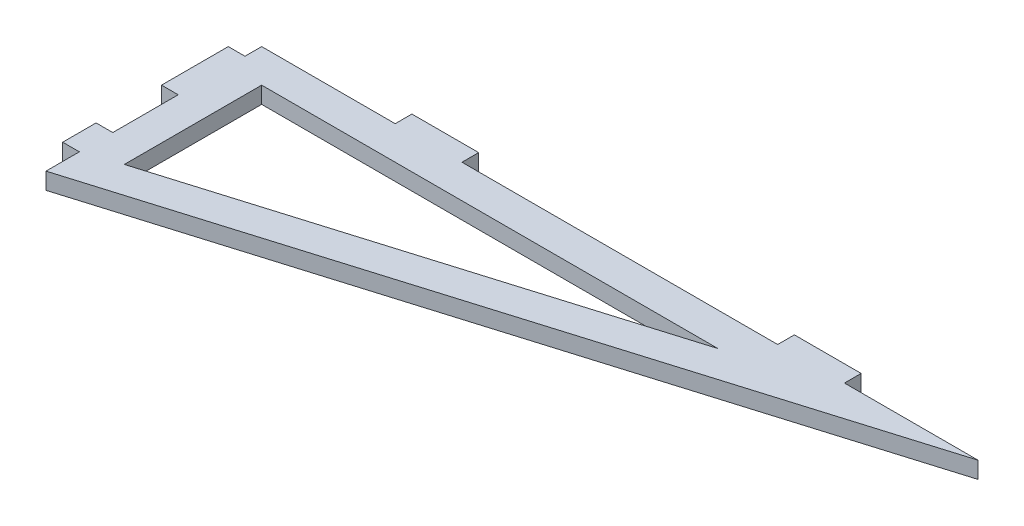
ISO-10303-21;
HEADER;
FILE_DESCRIPTION(('STEP AP214'),'2;1');
FILE_NAME('part.step','',(''),(''),'','','');
FILE_SCHEMA(('AUTOMOTIVE_DESIGN { 1 0 10303 214 1 1 1 1 }'));
ENDSEC;
DATA;
#1=APPLICATION_CONTEXT('core data for automotive mechanical design processes');
#2=APPLICATION_PROTOCOL_DEFINITION('international standard','automotive_design',2000,#1);
#3=PRODUCT_CONTEXT('',#1,'mechanical');
#4=PRODUCT('Part','Part','',(#3));
#5=PRODUCT_RELATED_PRODUCT_CATEGORY('part','',(#4));
#6=PRODUCT_DEFINITION_FORMATION('','',#4);
#7=PRODUCT_DEFINITION_CONTEXT('part definition',#1,'design');
#8=PRODUCT_DEFINITION('design','',#6,#7);
#9=PRODUCT_DEFINITION_SHAPE('','',#8);
#10=(LENGTH_UNIT() NAMED_UNIT(*) SI_UNIT(.MILLI.,.METRE.));
#11=(NAMED_UNIT(*) PLANE_ANGLE_UNIT() SI_UNIT($,.RADIAN.));
#12=(NAMED_UNIT(*) SI_UNIT($,.STERADIAN.) SOLID_ANGLE_UNIT());
#13=UNCERTAINTY_MEASURE_WITH_UNIT(LENGTH_MEASURE(1.E-05),#10,'distance_accuracy_value','');
#14=(GEOMETRIC_REPRESENTATION_CONTEXT(3) GLOBAL_UNCERTAINTY_ASSIGNED_CONTEXT((#13)) GLOBAL_UNIT_ASSIGNED_CONTEXT((#10,
#11,#12)) REPRESENTATION_CONTEXT('',''));
#15=CARTESIAN_POINT('',(0.,0.,0.));
#16=DIRECTION('',(0.,0.,1.));
#17=DIRECTION('',(1.,0.,0.));
#18=AXIS2_PLACEMENT_3D('',#15,#16,#17);
#19=CARTESIAN_POINT('',(0.,3.175,0.));
#20=DIRECTION('',(0.,-1.,0.));
#21=DIRECTION('',(0.,0.,-1.));
#22=AXIS2_PLACEMENT_3D('',#19,#20,#21);
#23=PLANE('',#22);
#24=DIRECTION('',(0.957542789492705,0.,-0.288291183164746));
#25=VECTOR('',#24,1.);
#26=CARTESIAN_POINT('',(-68.1228,3.175,20.51));
#27=LINE('',#26,#25);
#28=CARTESIAN_POINT('',(-68.1228,3.175,20.51));
#29=VERTEX_POINT('',#28);
#30=CARTESIAN_POINT('',(68.1228,3.175,-20.51));
#31=VERTEX_POINT('',#30);
#32=EDGE_CURVE('E209',#29,#31,#27,.T.);
#33=ORIENTED_EDGE('',*,*,#32,.T.);
#34=DIRECTION('',(-1.,0.,0.));
#35=VECTOR('',#34,1.);
#36=CARTESIAN_POINT('',(68.1228,3.175,-20.51));
#37=LINE('',#36,#35);
#38=CARTESIAN_POINT('',(42.7228,3.175,-20.51));
#39=VERTEX_POINT('',#38);
#40=EDGE_CURVE('E212',#31,#39,#37,.T.);
#41=ORIENTED_EDGE('',*,*,#40,.T.);
#42=DIRECTION('',(0.,0.,-1.));
#43=VECTOR('',#42,1.);
#44=CARTESIAN_POINT('',(42.7228,3.175,-23.685));
#45=LINE('',#44,#43);
#46=CARTESIAN_POINT('',(42.7228,3.175,-23.685));
#47=VERTEX_POINT('',#46);
#48=EDGE_CURVE('E215',#39,#47,#45,.T.);
#49=ORIENTED_EDGE('',*,*,#48,.T.);
#50=DIRECTION('',(-1.,0.,0.));
#51=VECTOR('',#50,1.);
#52=CARTESIAN_POINT('',(30.0228,3.175,-23.685));
#53=LINE('',#52,#51);
#54=CARTESIAN_POINT('',(30.0228,3.175,-23.685));
#55=VERTEX_POINT('',#54);
#56=EDGE_CURVE('E217',#47,#55,#53,.T.);
#57=ORIENTED_EDGE('',*,*,#56,.T.);
#58=DIRECTION('',(0.,0.,1.));
#59=VECTOR('',#58,1.);
#60=CARTESIAN_POINT('',(30.0228,3.175,-20.51));
#61=LINE('',#60,#59);
#62=CARTESIAN_POINT('',(30.0228,3.175,-20.51));
#63=VERTEX_POINT('',#62);
#64=EDGE_CURVE('E219',#55,#63,#61,.T.);
#65=ORIENTED_EDGE('',*,*,#64,.T.);
#66=DIRECTION('',(-1.,0.,0.));
#67=VECTOR('',#66,1.);
#68=CARTESIAN_POINT('',(30.0228,3.175,-20.51));
#69=LINE('',#68,#67);
#70=CARTESIAN_POINT('',(-30.0228,3.175,-20.51));
#71=VERTEX_POINT('',#70);
#72=EDGE_CURVE('E221',#63,#71,#69,.T.);
#73=ORIENTED_EDGE('',*,*,#72,.T.);
#74=DIRECTION('',(0.,0.,-1.));
#75=VECTOR('',#74,1.);
#76=CARTESIAN_POINT('',(-30.0228,3.175,-23.685));
#77=LINE('',#76,#75);
#78=CARTESIAN_POINT('',(-30.0228,3.175,-23.685));
#79=VERTEX_POINT('',#78);
#80=EDGE_CURVE('E223',#71,#79,#77,.T.);
#81=ORIENTED_EDGE('',*,*,#80,.T.);
#82=DIRECTION('',(-1.,0.,0.));
#83=VECTOR('',#82,1.);
#84=CARTESIAN_POINT('',(-42.7228,3.175,-23.685));
#85=LINE('',#84,#83);
#86=CARTESIAN_POINT('',(-42.7228,3.175,-23.685));
#87=VERTEX_POINT('',#86);
#88=EDGE_CURVE('E225',#79,#87,#85,.T.);
#89=ORIENTED_EDGE('',*,*,#88,.T.);
#90=DIRECTION('',(0.,0.,1.));
#91=VECTOR('',#90,1.);
#92=CARTESIAN_POINT('',(-42.7228,3.175,-20.51));
#93=LINE('',#92,#91);
#94=CARTESIAN_POINT('',(-42.7228,3.175,-20.51));
#95=VERTEX_POINT('',#94);
#96=EDGE_CURVE('E227',#87,#95,#93,.T.);
#97=ORIENTED_EDGE('',*,*,#96,.T.);
#98=DIRECTION('',(-1.,0.,0.));
#99=VECTOR('',#98,1.);
#100=CARTESIAN_POINT('',(-42.7228,3.175,-20.51));
#101=LINE('',#100,#99);
#102=CARTESIAN_POINT('',(-68.1228,3.175,-20.51));
#103=VERTEX_POINT('',#102);
#104=EDGE_CURVE('E229',#95,#103,#101,.T.);
#105=ORIENTED_EDGE('',*,*,#104,.T.);
#106=DIRECTION('',(0.,0.,1.));
#107=VECTOR('',#106,1.);
#108=CARTESIAN_POINT('',(-68.1228,3.175,-20.51));
#109=LINE('',#108,#107);
#110=CARTESIAN_POINT('',(-68.1228,3.175,-17.335));
#111=VERTEX_POINT('',#110);
#112=EDGE_CURVE('E231',#103,#111,#109,.T.);
#113=ORIENTED_EDGE('',*,*,#112,.T.);
#114=DIRECTION('',(-1.,0.,0.));
#115=VECTOR('',#114,1.);
#116=CARTESIAN_POINT('',(-71.2978,3.175,-17.335));
#117=LINE('',#116,#115);
#118=CARTESIAN_POINT('',(-71.2978,3.175,-17.335));
#119=VERTEX_POINT('',#118);
#120=EDGE_CURVE('E233',#111,#119,#117,.T.);
#121=ORIENTED_EDGE('',*,*,#120,.T.);
#122=DIRECTION('',(0.,0.,1.));
#123=VECTOR('',#122,1.);
#124=CARTESIAN_POINT('',(-71.2978,3.175,-4.63499999999999));
#125=LINE('',#124,#123);
#126=CARTESIAN_POINT('',(-71.2978,3.175,-4.63499999999999));
#127=VERTEX_POINT('',#126);
#128=EDGE_CURVE('E235',#119,#127,#125,.T.);
#129=ORIENTED_EDGE('',*,*,#128,.T.);
#130=DIRECTION('',(1.,0.,0.));
#131=VECTOR('',#130,1.);
#132=CARTESIAN_POINT('',(-71.2978,3.175,-4.63499999999999));
#133=LINE('',#132,#131);
#134=CARTESIAN_POINT('',(-68.1228,3.175,-4.63499999999999));
#135=VERTEX_POINT('',#134);
#136=EDGE_CURVE('E237',#127,#135,#133,.T.);
#137=ORIENTED_EDGE('',*,*,#136,.T.);
#138=DIRECTION('',(0.,0.,1.));
#139=VECTOR('',#138,1.);
#140=CARTESIAN_POINT('',(-68.1228,3.175,-4.63499999999999));
#141=LINE('',#140,#139);
#142=CARTESIAN_POINT('',(-68.1228,3.175,7.81));
#143=VERTEX_POINT('',#142);
#144=EDGE_CURVE('E239',#135,#143,#141,.T.);
#145=ORIENTED_EDGE('',*,*,#144,.T.);
#146=DIRECTION('',(-1.,0.,0.));
#147=VECTOR('',#146,1.);
#148=CARTESIAN_POINT('',(-68.1228,3.175,7.81));
#149=LINE('',#148,#147);
#150=CARTESIAN_POINT('',(-71.2978,3.175,7.81));
#151=VERTEX_POINT('',#150);
#152=EDGE_CURVE('E241',#143,#151,#149,.T.);
#153=ORIENTED_EDGE('',*,*,#152,.T.);
#154=DIRECTION('',(0.,0.,1.));
#155=VECTOR('',#154,1.);
#156=CARTESIAN_POINT('',(-71.2978,3.175,7.81));
#157=LINE('',#156,#155);
#158=CARTESIAN_POINT('',(-71.2978,3.175,14.16));
#159=VERTEX_POINT('',#158);
#160=EDGE_CURVE('E243',#151,#159,#157,.T.);
#161=ORIENTED_EDGE('',*,*,#160,.T.);
#162=DIRECTION('',(1.,0.,0.));
#163=VECTOR('',#162,1.);
#164=CARTESIAN_POINT('',(-71.2978,3.175,14.16));
#165=LINE('',#164,#163);
#166=CARTESIAN_POINT('',(-68.1228,3.175,14.16));
#167=VERTEX_POINT('',#166);
#168=EDGE_CURVE('E245',#159,#167,#165,.T.);
#169=ORIENTED_EDGE('',*,*,#168,.T.);
#170=DIRECTION('',(0.,0.,1.));
#171=VECTOR('',#170,1.);
#172=CARTESIAN_POINT('',(-68.1228,3.175,14.16));
#173=LINE('',#172,#171);
#174=EDGE_CURVE('E247',#167,#29,#173,.T.);
#175=ORIENTED_EDGE('',*,*,#174,.T.);
#176=EDGE_LOOP('',(#33,#41,#49,#57,#65,#73,#81,#89,#97,#105,#113,#121,#129,#137,#145,#153,#161,
#169,#175));
#177=FACE_BOUND('',#176,.T.);
#178=DIRECTION('',(-1.,0.,0.));
#179=VECTOR('',#178,1.);
#180=CARTESIAN_POINT('',(25.0052943696762,3.175,-14.16));
#181=LINE('',#180,#179);
#182=CARTESIAN_POINT('',(25.0052943696762,3.175,-14.16));
#183=VERTEX_POINT('',#182);
#184=CARTESIAN_POINT('',(-61.7728,3.175,-14.16));
#185=VERTEX_POINT('',#184);
#186=EDGE_CURVE('E182',#183,#185,#181,.T.);
#187=ORIENTED_EDGE('',*,*,#186,.F.);
#188=DIRECTION('',(0.957542789492705,0.,-0.288291183164746));
#189=VECTOR('',#188,1.);
#190=CARTESIAN_POINT('',(-61.7728,3.175,11.9666230325538));
#191=LINE('',#190,#189);
#192=CARTESIAN_POINT('',(-61.7728,3.175,11.9666230325538));
#193=VERTEX_POINT('',#192);
#194=EDGE_CURVE('E199',#193,#183,#191,.T.);
#195=ORIENTED_EDGE('',*,*,#194,.F.);
#196=DIRECTION('',(0.,0.,1.));
#197=VECTOR('',#196,1.);
#198=CARTESIAN_POINT('',(-61.7728,3.175,-14.16));
#199=LINE('',#198,#197);
#200=EDGE_CURVE('E190',#185,#193,#199,.T.);
#201=ORIENTED_EDGE('',*,*,#200,.F.);
#202=EDGE_LOOP('',(#187,#195,#201));
#203=FACE_BOUND('',#202,.T.);
#204=ADVANCED_FACE('F33',(#177,#203),#23,.F.);
#205=CARTESIAN_POINT('',(0.,0.,0.));
#206=DIRECTION('',(0.,-1.,0.));
#207=DIRECTION('',(0.,0.,-1.));
#208=AXIS2_PLACEMENT_3D('',#205,#206,#207);
#209=PLANE('',#208);
#210=DIRECTION('',(0.957542789492705,0.,-0.288291183164746));
#211=VECTOR('',#210,1.);
#212=CARTESIAN_POINT('',(-68.1228,0.,20.51));
#213=LINE('',#212,#211);
#214=CARTESIAN_POINT('',(-68.1228,0.,20.51));
#215=VERTEX_POINT('',#214);
#216=CARTESIAN_POINT('',(68.1228,0.,-20.51));
#217=VERTEX_POINT('',#216);
#218=EDGE_CURVE('E197',#215,#217,#213,.T.);
#219=ORIENTED_EDGE('',*,*,#218,.F.);
#220=DIRECTION('',(0.,0.,1.));
#221=VECTOR('',#220,1.);
#222=CARTESIAN_POINT('',(-68.1228,0.,14.16));
#223=LINE('',#222,#221);
#224=CARTESIAN_POINT('',(-68.1228,0.,14.16));
#225=VERTEX_POINT('',#224);
#226=EDGE_CURVE('E213',#225,#215,#223,.T.);
#227=ORIENTED_EDGE('',*,*,#226,.F.);
#228=DIRECTION('',(1.,0.,0.));
#229=VECTOR('',#228,1.);
#230=CARTESIAN_POINT('',(-71.2978,0.,14.16));
#231=LINE('',#230,#229);
#232=CARTESIAN_POINT('',(-71.2978,0.,14.16));
#233=VERTEX_POINT('',#232);
#234=EDGE_CURVE('E284',#233,#225,#231,.T.);
#235=ORIENTED_EDGE('',*,*,#234,.F.);
#236=DIRECTION('',(0.,0.,1.));
#237=VECTOR('',#236,1.);
#238=CARTESIAN_POINT('',(-71.2978,0.,7.81));
#239=LINE('',#238,#237);
#240=CARTESIAN_POINT('',(-71.2978,0.,7.81));
#241=VERTEX_POINT('',#240);
#242=EDGE_CURVE('E282',#241,#233,#239,.T.);
#243=ORIENTED_EDGE('',*,*,#242,.F.);
#244=DIRECTION('',(-1.,0.,0.));
#245=VECTOR('',#244,1.);
#246=CARTESIAN_POINT('',(-68.1228,0.,7.81));
#247=LINE('',#246,#245);
#248=CARTESIAN_POINT('',(-68.1228,0.,7.81));
#249=VERTEX_POINT('',#248);
#250=EDGE_CURVE('E280',#249,#241,#247,.T.);
#251=ORIENTED_EDGE('',*,*,#250,.F.);
#252=DIRECTION('',(0.,0.,1.));
#253=VECTOR('',#252,1.);
#254=CARTESIAN_POINT('',(-68.1228,0.,-4.63499999999999));
#255=LINE('',#254,#253);
#256=CARTESIAN_POINT('',(-68.1228,0.,-4.63499999999999));
#257=VERTEX_POINT('',#256);
#258=EDGE_CURVE('E278',#257,#249,#255,.T.);
#259=ORIENTED_EDGE('',*,*,#258,.F.);
#260=DIRECTION('',(1.,0.,0.));
#261=VECTOR('',#260,1.);
#262=CARTESIAN_POINT('',(-71.2978,0.,-4.63499999999999));
#263=LINE('',#262,#261);
#264=CARTESIAN_POINT('',(-71.2978,0.,-4.63499999999999));
#265=VERTEX_POINT('',#264);
#266=EDGE_CURVE('E276',#265,#257,#263,.T.);
#267=ORIENTED_EDGE('',*,*,#266,.F.);
#268=DIRECTION('',(0.,0.,1.));
#269=VECTOR('',#268,1.);
#270=CARTESIAN_POINT('',(-71.2978,0.,-4.63499999999999));
#271=LINE('',#270,#269);
#272=CARTESIAN_POINT('',(-71.2978,0.,-17.335));
#273=VERTEX_POINT('',#272);
#274=EDGE_CURVE('E274',#273,#265,#271,.T.);
#275=ORIENTED_EDGE('',*,*,#274,.F.);
#276=DIRECTION('',(-1.,0.,0.));
#277=VECTOR('',#276,1.);
#278=CARTESIAN_POINT('',(-71.2978,0.,-17.335));
#279=LINE('',#278,#277);
#280=CARTESIAN_POINT('',(-68.1228,0.,-17.335));
#281=VERTEX_POINT('',#280);
#282=EDGE_CURVE('E272',#281,#273,#279,.T.);
#283=ORIENTED_EDGE('',*,*,#282,.F.);
#284=DIRECTION('',(0.,0.,1.));
#285=VECTOR('',#284,1.);
#286=CARTESIAN_POINT('',(-68.1228,0.,-20.51));
#287=LINE('',#286,#285);
#288=CARTESIAN_POINT('',(-68.1228,0.,-20.51));
#289=VERTEX_POINT('',#288);
#290=EDGE_CURVE('E270',#289,#281,#287,.T.);
#291=ORIENTED_EDGE('',*,*,#290,.F.);
#292=DIRECTION('',(-1.,0.,0.));
#293=VECTOR('',#292,1.);
#294=CARTESIAN_POINT('',(-42.7228,0.,-20.51));
#295=LINE('',#294,#293);
#296=CARTESIAN_POINT('',(-42.7228,0.,-20.51));
#297=VERTEX_POINT('',#296);
#298=EDGE_CURVE('E268',#297,#289,#295,.T.);
#299=ORIENTED_EDGE('',*,*,#298,.F.);
#300=DIRECTION('',(0.,0.,1.));
#301=VECTOR('',#300,1.);
#302=CARTESIAN_POINT('',(-42.7228,0.,-20.51));
#303=LINE('',#302,#301);
#304=CARTESIAN_POINT('',(-42.7228,0.,-23.685));
#305=VERTEX_POINT('',#304);
#306=EDGE_CURVE('E266',#305,#297,#303,.T.);
#307=ORIENTED_EDGE('',*,*,#306,.F.);
#308=DIRECTION('',(-1.,0.,0.));
#309=VECTOR('',#308,1.);
#310=CARTESIAN_POINT('',(-42.7228,0.,-23.685));
#311=LINE('',#310,#309);
#312=CARTESIAN_POINT('',(-30.0228,0.,-23.685));
#313=VERTEX_POINT('',#312);
#314=EDGE_CURVE('E264',#313,#305,#311,.T.);
#315=ORIENTED_EDGE('',*,*,#314,.F.);
#316=DIRECTION('',(0.,0.,-1.));
#317=VECTOR('',#316,1.);
#318=CARTESIAN_POINT('',(-30.0228,0.,-23.685));
#319=LINE('',#318,#317);
#320=CARTESIAN_POINT('',(-30.0228,0.,-20.51));
#321=VERTEX_POINT('',#320);
#322=EDGE_CURVE('E262',#321,#313,#319,.T.);
#323=ORIENTED_EDGE('',*,*,#322,.F.);
#324=DIRECTION('',(-1.,0.,0.));
#325=VECTOR('',#324,1.);
#326=CARTESIAN_POINT('',(30.0228,0.,-20.51));
#327=LINE('',#326,#325);
#328=CARTESIAN_POINT('',(30.0228,0.,-20.51));
#329=VERTEX_POINT('',#328);
#330=EDGE_CURVE('E260',#329,#321,#327,.T.);
#331=ORIENTED_EDGE('',*,*,#330,.F.);
#332=DIRECTION('',(0.,0.,1.));
#333=VECTOR('',#332,1.);
#334=CARTESIAN_POINT('',(30.0228,0.,-20.51));
#335=LINE('',#334,#333);
#336=CARTESIAN_POINT('',(30.0228,0.,-23.685));
#337=VERTEX_POINT('',#336);
#338=EDGE_CURVE('E258',#337,#329,#335,.T.);
#339=ORIENTED_EDGE('',*,*,#338,.F.);
#340=DIRECTION('',(-1.,0.,0.));
#341=VECTOR('',#340,1.);
#342=CARTESIAN_POINT('',(30.0228,0.,-23.685));
#343=LINE('',#342,#341);
#344=CARTESIAN_POINT('',(42.7228,0.,-23.685));
#345=VERTEX_POINT('',#344);
#346=EDGE_CURVE('E256',#345,#337,#343,.T.);
#347=ORIENTED_EDGE('',*,*,#346,.F.);
#348=DIRECTION('',(0.,0.,-1.));
#349=VECTOR('',#348,1.);
#350=CARTESIAN_POINT('',(42.7228,0.,-23.685));
#351=LINE('',#350,#349);
#352=CARTESIAN_POINT('',(42.7228,0.,-20.51));
#353=VERTEX_POINT('',#352);
#354=EDGE_CURVE('E254',#353,#345,#351,.T.);
#355=ORIENTED_EDGE('',*,*,#354,.F.);
#356=DIRECTION('',(-1.,0.,0.));
#357=VECTOR('',#356,1.);
#358=CARTESIAN_POINT('',(68.1228,0.,-20.51));
#359=LINE('',#358,#357);
#360=EDGE_CURVE('E252',#217,#353,#359,.T.);
#361=ORIENTED_EDGE('',*,*,#360,.F.);
#362=EDGE_LOOP('',(#219,#227,#235,#243,#251,#259,#267,#275,#283,#291,#299,#307,#315,#323,#331,
#339,#347,#355,#361));
#363=FACE_BOUND('',#362,.T.);
#364=DIRECTION('',(0.957542789492705,0.,-0.288291183164746));
#365=VECTOR('',#364,1.);
#366=CARTESIAN_POINT('',(-61.7728,0.,11.9666230325538));
#367=LINE('',#366,#365);
#368=CARTESIAN_POINT('',(-61.7728,0.,11.9666230325538));
#369=VERTEX_POINT('',#368);
#370=CARTESIAN_POINT('',(25.0052943696762,0.,-14.16));
#371=VERTEX_POINT('',#370);
#372=EDGE_CURVE('E191',#369,#371,#367,.T.);
#373=ORIENTED_EDGE('',*,*,#372,.T.);
#374=DIRECTION('',(-1.,0.,0.));
#375=VECTOR('',#374,1.);
#376=CARTESIAN_POINT('',(25.0052943696762,0.,-14.16));
#377=LINE('',#376,#375);
#378=CARTESIAN_POINT('',(-61.7728,0.,-14.16));
#379=VERTEX_POINT('',#378);
#380=EDGE_CURVE('E56',#371,#379,#377,.T.);
#381=ORIENTED_EDGE('',*,*,#380,.T.);
#382=DIRECTION('',(0.,0.,1.));
#383=VECTOR('',#382,1.);
#384=CARTESIAN_POINT('',(-61.7728,0.,-14.16));
#385=LINE('',#384,#383);
#386=EDGE_CURVE('E196',#379,#369,#385,.T.);
#387=ORIENTED_EDGE('',*,*,#386,.T.);
#388=EDGE_LOOP('',(#373,#381,#387));
#389=FACE_BOUND('',#388,.T.);
#390=ADVANCED_FACE('F347',(#363,#389),#209,.T.);
#391=CARTESIAN_POINT('',(-68.1228,3.175,20.51));
#392=DIRECTION('',(-0.288291183164746,0.,-0.957542789492705));
#393=DIRECTION('',(-0.957542789492705,0.,0.288291183164746));
#394=AXIS2_PLACEMENT_3D('',#391,#392,#393);
#395=PLANE('',#394);
#396=ORIENTED_EDGE('',*,*,#218,.T.);
#397=DIRECTION('',(0.,-1.,0.));
#398=VECTOR('',#397,1.);
#399=CARTESIAN_POINT('',(68.1228,3.175,-20.51));
#400=LINE('',#399,#398);
#401=EDGE_CURVE('E11',#31,#217,#400,.T.);
#402=ORIENTED_EDGE('',*,*,#401,.F.);
#403=ORIENTED_EDGE('',*,*,#32,.F.);
#404=DIRECTION('',(0.,-1.,0.));
#405=VECTOR('',#404,1.);
#406=CARTESIAN_POINT('',(-68.1228,3.175,20.51));
#407=LINE('',#406,#405);
#408=EDGE_CURVE('E249',#29,#215,#407,.T.);
#409=ORIENTED_EDGE('',*,*,#408,.T.);
#410=EDGE_LOOP('',(#396,#402,#403,#409));
#411=FACE_BOUND('',#410,.T.);
#412=ADVANCED_FACE('F35',(#411),#395,.F.);
#413=CARTESIAN_POINT('',(68.1228,3.175,-20.51));
#414=DIRECTION('',(0.,0.,1.));
#415=DIRECTION('',(1.,0.,0.));
#416=AXIS2_PLACEMENT_3D('',#413,#414,#415);
#417=PLANE('',#416);
#418=ORIENTED_EDGE('',*,*,#360,.T.);
#419=DIRECTION('',(0.,-1.,0.));
#420=VECTOR('',#419,1.);
#421=CARTESIAN_POINT('',(42.7228,3.175,-20.51));
#422=LINE('',#421,#420);
#423=EDGE_CURVE('E41',#39,#353,#422,.T.);
#424=ORIENTED_EDGE('',*,*,#423,.F.);
#425=ORIENTED_EDGE('',*,*,#40,.F.);
#426=ORIENTED_EDGE('',*,*,#401,.T.);
#427=EDGE_LOOP('',(#418,#424,#425,#426));
#428=FACE_BOUND('',#427,.T.);
#429=ADVANCED_FACE('F364',(#428),#417,.F.);
#430=CARTESIAN_POINT('',(42.7228,3.175,-23.685));
#431=DIRECTION('',(-1.,0.,0.));
#432=DIRECTION('',(0.,0.,1.));
#433=AXIS2_PLACEMENT_3D('',#430,#431,#432);
#434=PLANE('',#433);
#435=ORIENTED_EDGE('',*,*,#354,.T.);
#436=DIRECTION('',(0.,-1.,0.));
#437=VECTOR('',#436,1.);
#438=CARTESIAN_POINT('',(42.7228,3.175,-23.685));
#439=LINE('',#438,#437);
#440=EDGE_CURVE('E334',#47,#345,#439,.T.);
#441=ORIENTED_EDGE('',*,*,#440,.F.);
#442=ORIENTED_EDGE('',*,*,#48,.F.);
#443=ORIENTED_EDGE('',*,*,#423,.T.);
#444=EDGE_LOOP('',(#435,#441,#442,#443));
#445=FACE_BOUND('',#444,.T.);
#446=ADVANCED_FACE('F341',(#445),#434,.F.);
#447=CARTESIAN_POINT('',(30.0228,3.175,-23.685));
#448=DIRECTION('',(0.,0.,1.));
#449=DIRECTION('',(1.,0.,0.));
#450=AXIS2_PLACEMENT_3D('',#447,#448,#449);
#451=PLANE('',#450);
#452=ORIENTED_EDGE('',*,*,#346,.T.);
#453=DIRECTION('',(0.,-1.,0.));
#454=VECTOR('',#453,1.);
#455=CARTESIAN_POINT('',(30.0228,3.175,-23.685));
#456=LINE('',#455,#454);
#457=EDGE_CURVE('E331',#55,#337,#456,.T.);
#458=ORIENTED_EDGE('',*,*,#457,.F.);
#459=ORIENTED_EDGE('',*,*,#56,.F.);
#460=ORIENTED_EDGE('',*,*,#440,.T.);
#461=EDGE_LOOP('',(#452,#458,#459,#460));
#462=FACE_BOUND('',#461,.T.);
#463=ADVANCED_FACE('F353',(#462),#451,.F.);
#464=CARTESIAN_POINT('',(30.0228,3.175,-20.51));
#465=DIRECTION('',(1.,0.,0.));
#466=DIRECTION('',(0.,0.,-1.));
#467=AXIS2_PLACEMENT_3D('',#464,#465,#466);
#468=PLANE('',#467);
#469=ORIENTED_EDGE('',*,*,#338,.T.);
#470=DIRECTION('',(0.,-1.,0.));
#471=VECTOR('',#470,1.);
#472=CARTESIAN_POINT('',(30.0228,3.175,-20.51));
#473=LINE('',#472,#471);
#474=EDGE_CURVE('E328',#63,#329,#473,.T.);
#475=ORIENTED_EDGE('',*,*,#474,.F.);
#476=ORIENTED_EDGE('',*,*,#64,.F.);
#477=ORIENTED_EDGE('',*,*,#457,.T.);
#478=EDGE_LOOP('',(#469,#475,#476,#477));
#479=FACE_BOUND('',#478,.T.);
#480=ADVANCED_FACE('F357',(#479),#468,.F.);
#481=CARTESIAN_POINT('',(30.0228,3.175,-20.51));
#482=DIRECTION('',(0.,0.,1.));
#483=DIRECTION('',(1.,0.,0.));
#484=AXIS2_PLACEMENT_3D('',#481,#482,#483);
#485=PLANE('',#484);
#486=ORIENTED_EDGE('',*,*,#330,.T.);
#487=DIRECTION('',(0.,-1.,0.));
#488=VECTOR('',#487,1.);
#489=CARTESIAN_POINT('',(-30.0228,3.175,-20.51));
#490=LINE('',#489,#488);
#491=EDGE_CURVE('E325',#71,#321,#490,.T.);
#492=ORIENTED_EDGE('',*,*,#491,.F.);
#493=ORIENTED_EDGE('',*,*,#72,.F.);
#494=ORIENTED_EDGE('',*,*,#474,.T.);
#495=EDGE_LOOP('',(#486,#492,#493,#494));
#496=FACE_BOUND('',#495,.T.);
#497=ADVANCED_FACE('F432',(#496),#485,.F.);
#498=CARTESIAN_POINT('',(-30.0228,3.175,-23.685));
#499=DIRECTION('',(-1.,0.,0.));
#500=DIRECTION('',(0.,0.,1.));
#501=AXIS2_PLACEMENT_3D('',#498,#499,#500);
#502=PLANE('',#501);
#503=ORIENTED_EDGE('',*,*,#322,.T.);
#504=DIRECTION('',(0.,-1.,0.));
#505=VECTOR('',#504,1.);
#506=CARTESIAN_POINT('',(-30.0228,3.175,-23.685));
#507=LINE('',#506,#505);
#508=EDGE_CURVE('E322',#79,#313,#507,.T.);
#509=ORIENTED_EDGE('',*,*,#508,.F.);
#510=ORIENTED_EDGE('',*,*,#80,.F.);
#511=ORIENTED_EDGE('',*,*,#491,.T.);
#512=EDGE_LOOP('',(#503,#509,#510,#511));
#513=FACE_BOUND('',#512,.T.);
#514=ADVANCED_FACE('F429',(#513),#502,.F.);
#515=CARTESIAN_POINT('',(-42.7228,3.175,-23.685));
#516=DIRECTION('',(0.,0.,1.));
#517=DIRECTION('',(1.,0.,0.));
#518=AXIS2_PLACEMENT_3D('',#515,#516,#517);
#519=PLANE('',#518);
#520=ORIENTED_EDGE('',*,*,#314,.T.);
#521=DIRECTION('',(0.,-1.,0.));
#522=VECTOR('',#521,1.);
#523=CARTESIAN_POINT('',(-42.7228,3.175,-23.685));
#524=LINE('',#523,#522);
#525=EDGE_CURVE('E319',#87,#305,#524,.T.);
#526=ORIENTED_EDGE('',*,*,#525,.F.);
#527=ORIENTED_EDGE('',*,*,#88,.F.);
#528=ORIENTED_EDGE('',*,*,#508,.T.);
#529=EDGE_LOOP('',(#520,#526,#527,#528));
#530=FACE_BOUND('',#529,.T.);
#531=ADVANCED_FACE('F425',(#530),#519,.F.);
#532=CARTESIAN_POINT('',(-42.7228,3.175,-20.51));
#533=DIRECTION('',(1.,0.,0.));
#534=DIRECTION('',(0.,0.,-1.));
#535=AXIS2_PLACEMENT_3D('',#532,#533,#534);
#536=PLANE('',#535);
#537=ORIENTED_EDGE('',*,*,#306,.T.);
#538=DIRECTION('',(0.,-1.,0.));
#539=VECTOR('',#538,1.);
#540=CARTESIAN_POINT('',(-42.7228,3.175,-20.51));
#541=LINE('',#540,#539);
#542=EDGE_CURVE('E316',#95,#297,#541,.T.);
#543=ORIENTED_EDGE('',*,*,#542,.F.);
#544=ORIENTED_EDGE('',*,*,#96,.F.);
#545=ORIENTED_EDGE('',*,*,#525,.T.);
#546=EDGE_LOOP('',(#537,#543,#544,#545));
#547=FACE_BOUND('',#546,.T.);
#548=ADVANCED_FACE('F421',(#547),#536,.F.);
#549=CARTESIAN_POINT('',(-42.7228,3.175,-20.51));
#550=DIRECTION('',(0.,0.,1.));
#551=DIRECTION('',(1.,0.,0.));
#552=AXIS2_PLACEMENT_3D('',#549,#550,#551);
#553=PLANE('',#552);
#554=ORIENTED_EDGE('',*,*,#298,.T.);
#555=DIRECTION('',(0.,-1.,0.));
#556=VECTOR('',#555,1.);
#557=CARTESIAN_POINT('',(-68.1228,3.175,-20.51));
#558=LINE('',#557,#556);
#559=EDGE_CURVE('E313',#103,#289,#558,.T.);
#560=ORIENTED_EDGE('',*,*,#559,.F.);
#561=ORIENTED_EDGE('',*,*,#104,.F.);
#562=ORIENTED_EDGE('',*,*,#542,.T.);
#563=EDGE_LOOP('',(#554,#560,#561,#562));
#564=FACE_BOUND('',#563,.T.);
#565=ADVANCED_FACE('F416',(#564),#553,.F.);
#566=CARTESIAN_POINT('',(-68.1228,3.175,-20.51));
#567=DIRECTION('',(1.,0.,0.));
#568=DIRECTION('',(0.,0.,-1.));
#569=AXIS2_PLACEMENT_3D('',#566,#567,#568);
#570=PLANE('',#569);
#571=ORIENTED_EDGE('',*,*,#290,.T.);
#572=DIRECTION('',(0.,-1.,0.));
#573=VECTOR('',#572,1.);
#574=CARTESIAN_POINT('',(-68.1228,3.175,-17.335));
#575=LINE('',#574,#573);
#576=EDGE_CURVE('E310',#111,#281,#575,.T.);
#577=ORIENTED_EDGE('',*,*,#576,.F.);
#578=ORIENTED_EDGE('',*,*,#112,.F.);
#579=ORIENTED_EDGE('',*,*,#559,.T.);
#580=EDGE_LOOP('',(#571,#577,#578,#579));
#581=FACE_BOUND('',#580,.T.);
#582=ADVANCED_FACE('F410',(#581),#570,.F.);
#583=CARTESIAN_POINT('',(-71.2978,3.175,-17.335));
#584=DIRECTION('',(0.,0.,1.));
#585=DIRECTION('',(1.,0.,0.));
#586=AXIS2_PLACEMENT_3D('',#583,#584,#585);
#587=PLANE('',#586);
#588=ORIENTED_EDGE('',*,*,#282,.T.);
#589=DIRECTION('',(0.,-1.,0.));
#590=VECTOR('',#589,1.);
#591=CARTESIAN_POINT('',(-71.2978,3.175,-17.335));
#592=LINE('',#591,#590);
#593=EDGE_CURVE('E307',#119,#273,#592,.T.);
#594=ORIENTED_EDGE('',*,*,#593,.F.);
#595=ORIENTED_EDGE('',*,*,#120,.F.);
#596=ORIENTED_EDGE('',*,*,#576,.T.);
#597=EDGE_LOOP('',(#588,#594,#595,#596));
#598=FACE_BOUND('',#597,.T.);
#599=ADVANCED_FACE('F406',(#598),#587,.F.);
#600=CARTESIAN_POINT('',(-71.2978,3.175,-4.63499999999999));
#601=DIRECTION('',(1.,0.,0.));
#602=DIRECTION('',(0.,0.,-1.));
#603=AXIS2_PLACEMENT_3D('',#600,#601,#602);
#604=PLANE('',#603);
#605=ORIENTED_EDGE('',*,*,#274,.T.);
#606=DIRECTION('',(0.,-1.,0.));
#607=VECTOR('',#606,1.);
#608=CARTESIAN_POINT('',(-71.2978,3.175,-4.63499999999999));
#609=LINE('',#608,#607);
#610=EDGE_CURVE('E304',#127,#265,#609,.T.);
#611=ORIENTED_EDGE('',*,*,#610,.F.);
#612=ORIENTED_EDGE('',*,*,#128,.F.);
#613=ORIENTED_EDGE('',*,*,#593,.T.);
#614=EDGE_LOOP('',(#605,#611,#612,#613));
#615=FACE_BOUND('',#614,.T.);
#616=ADVANCED_FACE('F401',(#615),#604,.F.);
#617=CARTESIAN_POINT('',(-71.2978,3.175,-4.63499999999999));
#618=DIRECTION('',(0.,0.,-1.));
#619=DIRECTION('',(-1.,0.,0.));
#620=AXIS2_PLACEMENT_3D('',#617,#618,#619);
#621=PLANE('',#620);
#622=ORIENTED_EDGE('',*,*,#266,.T.);
#623=DIRECTION('',(0.,-1.,0.));
#624=VECTOR('',#623,1.);
#625=CARTESIAN_POINT('',(-68.1228,3.175,-4.63499999999999));
#626=LINE('',#625,#624);
#627=EDGE_CURVE('E301',#135,#257,#626,.T.);
#628=ORIENTED_EDGE('',*,*,#627,.F.);
#629=ORIENTED_EDGE('',*,*,#136,.F.);
#630=ORIENTED_EDGE('',*,*,#610,.T.);
#631=EDGE_LOOP('',(#622,#628,#629,#630));
#632=FACE_BOUND('',#631,.T.);
#633=ADVANCED_FACE('F395',(#632),#621,.F.);
#634=CARTESIAN_POINT('',(-68.1228,3.175,-4.63499999999999));
#635=DIRECTION('',(1.,0.,0.));
#636=DIRECTION('',(0.,0.,-1.));
#637=AXIS2_PLACEMENT_3D('',#634,#635,#636);
#638=PLANE('',#637);
#639=ORIENTED_EDGE('',*,*,#258,.T.);
#640=DIRECTION('',(0.,-1.,0.));
#641=VECTOR('',#640,1.);
#642=CARTESIAN_POINT('',(-68.1228,3.175,7.81));
#643=LINE('',#642,#641);
#644=EDGE_CURVE('E298',#143,#249,#643,.T.);
#645=ORIENTED_EDGE('',*,*,#644,.F.);
#646=ORIENTED_EDGE('',*,*,#144,.F.);
#647=ORIENTED_EDGE('',*,*,#627,.T.);
#648=EDGE_LOOP('',(#639,#645,#646,#647));
#649=FACE_BOUND('',#648,.T.);
#650=ADVANCED_FACE('F391',(#649),#638,.F.);
#651=CARTESIAN_POINT('',(-68.1228,3.175,7.81));
#652=DIRECTION('',(0.,0.,1.));
#653=DIRECTION('',(1.,0.,0.));
#654=AXIS2_PLACEMENT_3D('',#651,#652,#653);
#655=PLANE('',#654);
#656=ORIENTED_EDGE('',*,*,#250,.T.);
#657=DIRECTION('',(0.,-1.,0.));
#658=VECTOR('',#657,1.);
#659=CARTESIAN_POINT('',(-71.2978,3.175,7.81));
#660=LINE('',#659,#658);
#661=EDGE_CURVE('E295',#151,#241,#660,.T.);
#662=ORIENTED_EDGE('',*,*,#661,.F.);
#663=ORIENTED_EDGE('',*,*,#152,.F.);
#664=ORIENTED_EDGE('',*,*,#644,.T.);
#665=EDGE_LOOP('',(#656,#662,#663,#664));
#666=FACE_BOUND('',#665,.T.);
#667=ADVANCED_FACE('F386',(#666),#655,.F.);
#668=CARTESIAN_POINT('',(-71.2978,3.175,7.81));
#669=DIRECTION('',(1.,0.,0.));
#670=DIRECTION('',(0.,0.,-1.));
#671=AXIS2_PLACEMENT_3D('',#668,#669,#670);
#672=PLANE('',#671);
#673=ORIENTED_EDGE('',*,*,#242,.T.);
#674=DIRECTION('',(0.,-1.,0.));
#675=VECTOR('',#674,1.);
#676=CARTESIAN_POINT('',(-71.2978,3.175,14.16));
#677=LINE('',#676,#675);
#678=EDGE_CURVE('E292',#159,#233,#677,.T.);
#679=ORIENTED_EDGE('',*,*,#678,.F.);
#680=ORIENTED_EDGE('',*,*,#160,.F.);
#681=ORIENTED_EDGE('',*,*,#661,.T.);
#682=EDGE_LOOP('',(#673,#679,#680,#681));
#683=FACE_BOUND('',#682,.T.);
#684=ADVANCED_FACE('F380',(#683),#672,.F.);
#685=CARTESIAN_POINT('',(-71.2978,3.175,14.16));
#686=DIRECTION('',(0.,0.,-1.));
#687=DIRECTION('',(-1.,0.,0.));
#688=AXIS2_PLACEMENT_3D('',#685,#686,#687);
#689=PLANE('',#688);
#690=ORIENTED_EDGE('',*,*,#234,.T.);
#691=DIRECTION('',(0.,-1.,0.));
#692=VECTOR('',#691,1.);
#693=CARTESIAN_POINT('',(-68.1228,3.175,14.16));
#694=LINE('',#693,#692);
#695=EDGE_CURVE('E289',#167,#225,#694,.T.);
#696=ORIENTED_EDGE('',*,*,#695,.F.);
#697=ORIENTED_EDGE('',*,*,#168,.F.);
#698=ORIENTED_EDGE('',*,*,#678,.T.);
#699=EDGE_LOOP('',(#690,#696,#697,#698));
#700=FACE_BOUND('',#699,.T.);
#701=ADVANCED_FACE('F376',(#700),#689,.F.);
#702=CARTESIAN_POINT('',(-68.1228,3.175,14.16));
#703=DIRECTION('',(1.,0.,0.));
#704=DIRECTION('',(0.,0.,-1.));
#705=AXIS2_PLACEMENT_3D('',#702,#703,#704);
#706=PLANE('',#705);
#707=ORIENTED_EDGE('',*,*,#226,.T.);
#708=ORIENTED_EDGE('',*,*,#408,.F.);
#709=ORIENTED_EDGE('',*,*,#174,.F.);
#710=ORIENTED_EDGE('',*,*,#695,.T.);
#711=EDGE_LOOP('',(#707,#708,#709,#710));
#712=FACE_BOUND('',#711,.T.);
#713=ADVANCED_FACE('F371',(#712),#706,.F.);
#714=CARTESIAN_POINT('',(25.0052943696762,3.175,-14.16));
#715=DIRECTION('',(0.,0.,1.));
#716=DIRECTION('',(1.,0.,0.));
#717=AXIS2_PLACEMENT_3D('',#714,#715,#716);
#718=PLANE('',#717);
#719=ORIENTED_EDGE('',*,*,#380,.F.);
#720=DIRECTION('',(0.,-1.,0.));
#721=VECTOR('',#720,1.);
#722=CARTESIAN_POINT('',(25.0052943696762,3.175,-14.16));
#723=LINE('',#722,#721);
#724=EDGE_CURVE('E186',#183,#371,#723,.T.);
#725=ORIENTED_EDGE('',*,*,#724,.F.);
#726=ORIENTED_EDGE('',*,*,#186,.T.);
#727=DIRECTION('',(0.,-1.,0.));
#728=VECTOR('',#727,1.);
#729=CARTESIAN_POINT('',(-61.7728,3.175,-14.16));
#730=LINE('',#729,#728);
#731=EDGE_CURVE('E185',#185,#379,#730,.T.);
#732=ORIENTED_EDGE('',*,*,#731,.T.);
#733=EDGE_LOOP('',(#719,#725,#726,#732));
#734=FACE_BOUND('',#733,.T.);
#735=ADVANCED_FACE('F184',(#734),#718,.T.);
#736=CARTESIAN_POINT('',(-61.7728,3.175,-14.16));
#737=DIRECTION('',(1.,0.,0.));
#738=DIRECTION('',(0.,0.,-1.));
#739=AXIS2_PLACEMENT_3D('',#736,#737,#738);
#740=PLANE('',#739);
#741=ORIENTED_EDGE('',*,*,#386,.F.);
#742=ORIENTED_EDGE('',*,*,#731,.F.);
#743=ORIENTED_EDGE('',*,*,#200,.T.);
#744=DIRECTION('',(0.,-1.,0.));
#745=VECTOR('',#744,1.);
#746=CARTESIAN_POINT('',(-61.7728,3.175,11.9666230325538));
#747=LINE('',#746,#745);
#748=EDGE_CURVE('E48',#193,#369,#747,.T.);
#749=ORIENTED_EDGE('',*,*,#748,.T.);
#750=EDGE_LOOP('',(#741,#742,#743,#749));
#751=FACE_BOUND('',#750,.T.);
#752=ADVANCED_FACE('F194',(#751),#740,.T.);
#753=CARTESIAN_POINT('',(-61.7728,3.175,11.9666230325538));
#754=DIRECTION('',(-0.288291183164746,0.,-0.957542789492705));
#755=DIRECTION('',(-0.957542789492705,0.,0.288291183164746));
#756=AXIS2_PLACEMENT_3D('',#753,#754,#755);
#757=PLANE('',#756);
#758=ORIENTED_EDGE('',*,*,#372,.F.);
#759=ORIENTED_EDGE('',*,*,#748,.F.);
#760=ORIENTED_EDGE('',*,*,#194,.T.);
#761=ORIENTED_EDGE('',*,*,#724,.T.);
#762=EDGE_LOOP('',(#758,#759,#760,#761));
#763=FACE_BOUND('',#762,.T.);
#764=ADVANCED_FACE('F532',(#763),#757,.T.);
#765=CLOSED_SHELL('',(#204,#390,#412,#429,#446,#463,#480,#497,#514,#531,#548,#565,#582,#599,
#616,#633,#650,#667,#684,#701,#713,#735,#752,#764));
#766=MANIFOLD_SOLID_BREP('B2',#765);
#767=ADVANCED_BREP_SHAPE_REPRESENTATION('',(#18,#766),#14);
#768=SHAPE_DEFINITION_REPRESENTATION(#9,#767);
ENDSEC;
END-ISO-10303-21;
